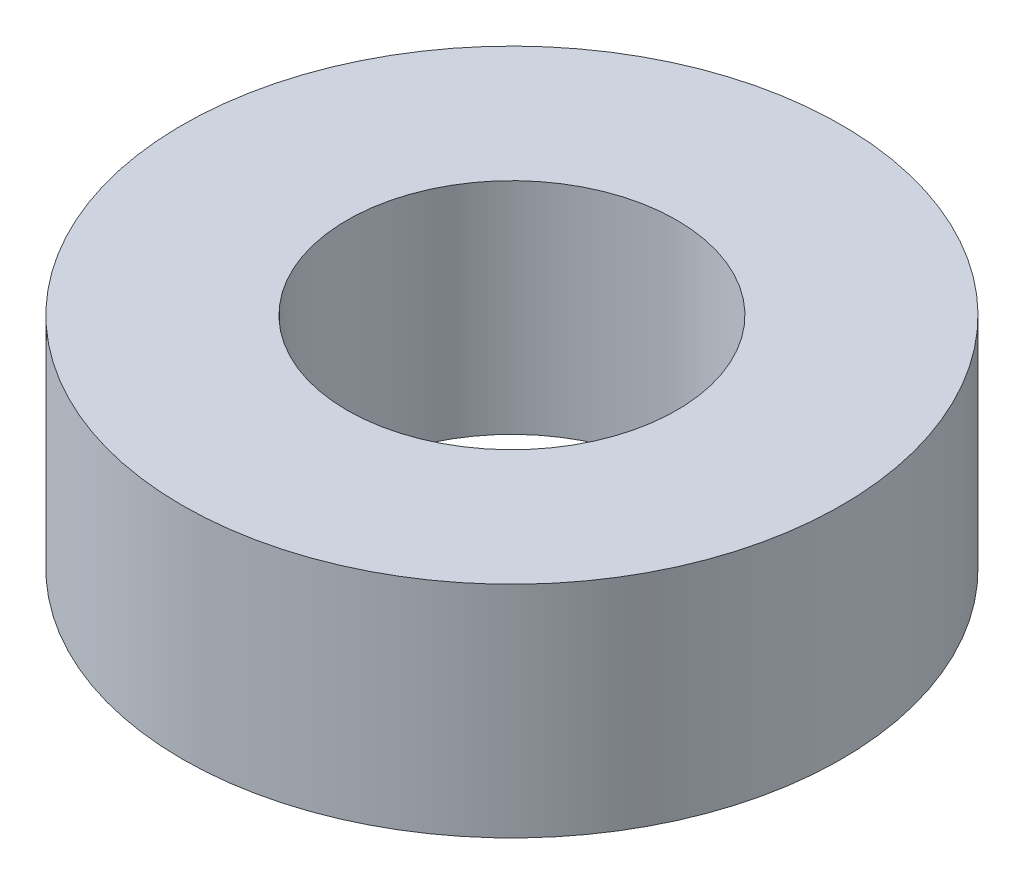
ISO-10303-21;
HEADER;
FILE_DESCRIPTION(('STEP AP214'),'2;1');
FILE_NAME('part.step','',(''),(''),'','','');
FILE_SCHEMA(('AUTOMOTIVE_DESIGN { 1 0 10303 214 1 1 1 1 }'));
ENDSEC;
DATA;
#1=APPLICATION_CONTEXT('core data for automotive mechanical design processes');
#2=APPLICATION_PROTOCOL_DEFINITION('international standard','automotive_design',2000,#1);
#3=PRODUCT_CONTEXT('',#1,'mechanical');
#4=PRODUCT('Part','Part','',(#3));
#5=PRODUCT_RELATED_PRODUCT_CATEGORY('part','',(#4));
#6=PRODUCT_DEFINITION_FORMATION('','',#4);
#7=PRODUCT_DEFINITION_CONTEXT('part definition',#1,'design');
#8=PRODUCT_DEFINITION('design','',#6,#7);
#9=PRODUCT_DEFINITION_SHAPE('','',#8);
#10=(LENGTH_UNIT() NAMED_UNIT(*) SI_UNIT(.MILLI.,.METRE.));
#11=(NAMED_UNIT(*) PLANE_ANGLE_UNIT() SI_UNIT($,.RADIAN.));
#12=(NAMED_UNIT(*) SI_UNIT($,.STERADIAN.) SOLID_ANGLE_UNIT());
#13=UNCERTAINTY_MEASURE_WITH_UNIT(LENGTH_MEASURE(1.E-05),#10,'distance_accuracy_value','');
#14=(GEOMETRIC_REPRESENTATION_CONTEXT(3) GLOBAL_UNCERTAINTY_ASSIGNED_CONTEXT((#13)) GLOBAL_UNIT_ASSIGNED_CONTEXT((#10,
#11,#12)) REPRESENTATION_CONTEXT('',''));
#15=CARTESIAN_POINT('',(0.,0.,0.));
#16=DIRECTION('',(0.,0.,1.));
#17=DIRECTION('',(1.,0.,0.));
#18=AXIS2_PLACEMENT_3D('',#15,#16,#17);
#19=CARTESIAN_POINT('',(0.,3.175,0.));
#20=DIRECTION('',(0.,1.,0.));
#21=DIRECTION('',(0.,0.,1.));
#22=AXIS2_PLACEMENT_3D('',#19,#20,#21);
#23=PLANE('',#22);
#24=CARTESIAN_POINT('',(0.,3.175,0.));
#25=DIRECTION('',(0.,1.,0.));
#26=DIRECTION('',(0.,0.,1.));
#27=AXIS2_PLACEMENT_3D('',#24,#25,#26);
#28=CIRCLE('',#27,4.7625);
#29=CARTESIAN_POINT('',(0.,3.175,4.7625));
#30=VERTEX_POINT('',#29);
#31=EDGE_CURVE('E10',#30,#30,#28,.T.);
#32=ORIENTED_EDGE('',*,*,#31,.T.);
#33=EDGE_LOOP('',(#32));
#34=FACE_BOUND('',#33,.T.);
#35=CARTESIAN_POINT('',(0.,3.175,0.));
#36=DIRECTION('',(0.,1.,0.));
#37=DIRECTION('',(0.,0.,1.));
#38=AXIS2_PLACEMENT_3D('',#35,#36,#37);
#39=CIRCLE('',#38,2.38125);
#40=CARTESIAN_POINT('',(0.,3.175,2.38125));
#41=VERTEX_POINT('',#40);
#42=EDGE_CURVE('E53',#41,#41,#39,.T.);
#43=ORIENTED_EDGE('',*,*,#42,.F.);
#44=EDGE_LOOP('',(#43));
#45=FACE_BOUND('',#44,.T.);
#46=ADVANCED_FACE('F40',(#34,#45),#23,.T.);
#47=CARTESIAN_POINT('',(0.,0.,0.));
#48=DIRECTION('',(0.,1.,0.));
#49=DIRECTION('',(0.,0.,1.));
#50=AXIS2_PLACEMENT_3D('',#47,#48,#49);
#51=PLANE('',#50);
#52=CARTESIAN_POINT('',(0.,0.,0.));
#53=DIRECTION('',(0.,1.,0.));
#54=DIRECTION('',(0.,0.,1.));
#55=AXIS2_PLACEMENT_3D('',#52,#53,#54);
#56=CIRCLE('',#55,4.7625);
#57=CARTESIAN_POINT('',(0.,0.,4.7625));
#58=VERTEX_POINT('',#57);
#59=EDGE_CURVE('E44',#58,#58,#56,.T.);
#60=ORIENTED_EDGE('',*,*,#59,.F.);
#61=EDGE_LOOP('',(#60));
#62=FACE_BOUND('',#61,.T.);
#63=CARTESIAN_POINT('',(0.,0.,0.));
#64=DIRECTION('',(0.,1.,0.));
#65=DIRECTION('',(0.,0.,1.));
#66=AXIS2_PLACEMENT_3D('',#63,#64,#65);
#67=CIRCLE('',#66,2.38125);
#68=CARTESIAN_POINT('',(0.,0.,2.38125));
#69=VERTEX_POINT('',#68);
#70=EDGE_CURVE('E55',#69,#69,#67,.T.);
#71=ORIENTED_EDGE('',*,*,#70,.T.);
#72=EDGE_LOOP('',(#71));
#73=FACE_BOUND('',#72,.T.);
#74=ADVANCED_FACE('F67',(#62,#73),#51,.F.);
#75=CARTESIAN_POINT('',(0.,3.175,0.));
#76=DIRECTION('',(0.,-1.,0.));
#77=DIRECTION('',(0.,0.,-1.));
#78=AXIS2_PLACEMENT_3D('',#75,#76,#77);
#79=CYLINDRICAL_SURFACE('',#78,4.7625);
#80=ORIENTED_EDGE('',*,*,#31,.F.);
#81=EDGE_LOOP('',(#80));
#82=FACE_BOUND('',#81,.T.);
#83=ORIENTED_EDGE('',*,*,#59,.T.);
#84=EDGE_LOOP('',(#83));
#85=FACE_BOUND('',#84,.T.);
#86=ADVANCED_FACE('F42',(#82,#85),#79,.T.);
#87=CARTESIAN_POINT('',(0.,3.175,0.));
#88=DIRECTION('',(0.,-1.,0.));
#89=DIRECTION('',(0.,0.,-1.));
#90=AXIS2_PLACEMENT_3D('',#87,#88,#89);
#91=CYLINDRICAL_SURFACE('',#90,2.38125);
#92=ORIENTED_EDGE('',*,*,#42,.T.);
#93=EDGE_LOOP('',(#92));
#94=FACE_BOUND('',#93,.T.);
#95=ORIENTED_EDGE('',*,*,#70,.F.);
#96=EDGE_LOOP('',(#95));
#97=FACE_BOUND('',#96,.T.);
#98=ADVANCED_FACE('F63',(#94,#97),#91,.F.);
#99=CLOSED_SHELL('',(#46,#74,#86,#98));
#100=MANIFOLD_SOLID_BREP('B2',#99);
#101=ADVANCED_BREP_SHAPE_REPRESENTATION('',(#18,#100),#14);
#102=SHAPE_DEFINITION_REPRESENTATION(#9,#101);
ENDSEC;
END-ISO-10303-21;
